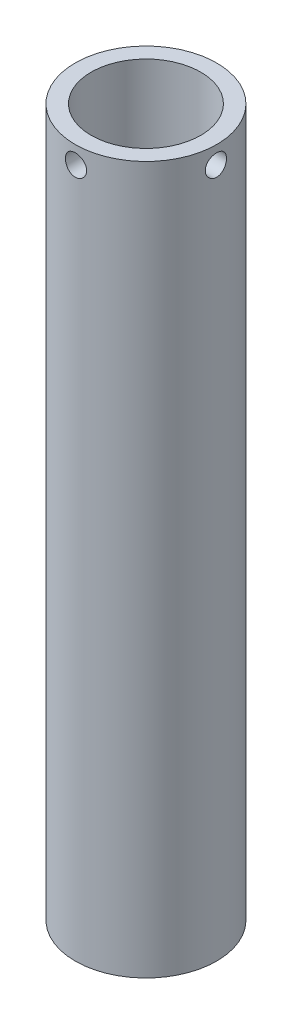
ISO-10303-21;
HEADER;
FILE_DESCRIPTION(('STEP AP214'),'2;1');
FILE_NAME('part.step','',(''),(''),'','','');
FILE_SCHEMA(('AUTOMOTIVE_DESIGN { 1 0 10303 214 1 1 1 1 }'));
ENDSEC;
DATA;
#1=APPLICATION_CONTEXT('core data for automotive mechanical design processes');
#2=APPLICATION_PROTOCOL_DEFINITION('international standard','automotive_design',2000,#1);
#3=PRODUCT_CONTEXT('',#1,'mechanical');
#4=PRODUCT('Part','Part','',(#3));
#5=PRODUCT_RELATED_PRODUCT_CATEGORY('part','',(#4));
#6=PRODUCT_DEFINITION_FORMATION('','',#4);
#7=PRODUCT_DEFINITION_CONTEXT('part definition',#1,'design');
#8=PRODUCT_DEFINITION('design','',#6,#7);
#9=PRODUCT_DEFINITION_SHAPE('','',#8);
#10=(LENGTH_UNIT() NAMED_UNIT(*) SI_UNIT(.MILLI.,.METRE.));
#11=(NAMED_UNIT(*) PLANE_ANGLE_UNIT() SI_UNIT($,.RADIAN.));
#12=(NAMED_UNIT(*) SI_UNIT($,.STERADIAN.) SOLID_ANGLE_UNIT());
#13=UNCERTAINTY_MEASURE_WITH_UNIT(LENGTH_MEASURE(1.E-05),#10,'distance_accuracy_value','');
#14=(GEOMETRIC_REPRESENTATION_CONTEXT(3) GLOBAL_UNCERTAINTY_ASSIGNED_CONTEXT((#13)) GLOBAL_UNIT_ASSIGNED_CONTEXT((#10,
#11,#12)) REPRESENTATION_CONTEXT('',''));
#15=CARTESIAN_POINT('',(0.,0.,0.));
#16=DIRECTION('',(0.,0.,1.));
#17=DIRECTION('',(1.,0.,0.));
#18=AXIS2_PLACEMENT_3D('',#15,#16,#17);
#19=CARTESIAN_POINT('',(0.,20.,0.));
#20=DIRECTION('',(0.,1.,0.));
#21=DIRECTION('',(0.,0.,1.));
#22=AXIS2_PLACEMENT_3D('',#19,#20,#21);
#23=PLANE('',#22);
#24=CARTESIAN_POINT('',(0.,20.,0.));
#25=DIRECTION('',(0.,1.,0.));
#26=DIRECTION('',(0.,0.,1.));
#27=AXIS2_PLACEMENT_3D('',#24,#25,#26);
#28=CIRCLE('',#27,2.);
#29=CARTESIAN_POINT('',(0.,20.,2.));
#30=VERTEX_POINT('',#29);
#31=EDGE_CURVE('E10',#30,#30,#28,.T.);
#32=ORIENTED_EDGE('',*,*,#31,.T.);
#33=EDGE_LOOP('',(#32));
#34=FACE_BOUND('',#33,.T.);
#35=CARTESIAN_POINT('',(0.,20.,0.));
#36=DIRECTION('',(0.,1.,0.));
#37=DIRECTION('',(0.,0.,1.));
#38=AXIS2_PLACEMENT_3D('',#35,#36,#37);
#39=CIRCLE('',#38,1.55);
#40=CARTESIAN_POINT('',(0.,20.,1.55));
#41=VERTEX_POINT('',#40);
#42=EDGE_CURVE('E43',#41,#41,#39,.T.);
#43=ORIENTED_EDGE('',*,*,#42,.F.);
#44=EDGE_LOOP('',(#43));
#45=FACE_BOUND('',#44,.T.);
#46=ADVANCED_FACE('F31',(#34,#45),#23,.T.);
#47=CARTESIAN_POINT('',(0.,0.,0.));
#48=DIRECTION('',(0.,1.,0.));
#49=DIRECTION('',(0.,0.,1.));
#50=AXIS2_PLACEMENT_3D('',#47,#48,#49);
#51=PLANE('',#50);
#52=CARTESIAN_POINT('',(0.,0.,0.));
#53=DIRECTION('',(0.,1.,0.));
#54=DIRECTION('',(0.,0.,1.));
#55=AXIS2_PLACEMENT_3D('',#52,#53,#54);
#56=CIRCLE('',#55,2.);
#57=CARTESIAN_POINT('',(0.,0.,2.));
#58=VERTEX_POINT('',#57);
#59=EDGE_CURVE('E36',#58,#58,#56,.T.);
#60=ORIENTED_EDGE('',*,*,#59,.F.);
#61=EDGE_LOOP('',(#60));
#62=FACE_BOUND('',#61,.T.);
#63=CARTESIAN_POINT('',(0.,0.,0.));
#64=DIRECTION('',(0.,1.,0.));
#65=DIRECTION('',(0.,0.,1.));
#66=AXIS2_PLACEMENT_3D('',#63,#64,#65);
#67=CIRCLE('',#66,1.55);
#68=CARTESIAN_POINT('',(0.,0.,1.55));
#69=VERTEX_POINT('',#68);
#70=EDGE_CURVE('E45',#69,#69,#67,.T.);
#71=ORIENTED_EDGE('',*,*,#70,.T.);
#72=EDGE_LOOP('',(#71));
#73=FACE_BOUND('',#72,.T.);
#74=ADVANCED_FACE('F77',(#62,#73),#51,.F.);
#75=CARTESIAN_POINT('',(0.,20.,0.));
#76=DIRECTION('',(0.,-1.,0.));
#77=DIRECTION('',(0.,0.,-1.));
#78=AXIS2_PLACEMENT_3D('',#75,#76,#77);
#79=CYLINDRICAL_SURFACE('',#78,2.);
#80=CARTESIAN_POINT('',(1.97737199332852,19.5,-0.299999999999993));
#81=CARTESIAN_POINT('',(1.97737227333718,19.483250886142,-0.299999308214561));
#82=CARTESIAN_POINT('',(1.9775871034782,19.4664920498499,-0.298592592776975));
#83=CARTESIAN_POINT('',(1.97842262960648,19.4334429370234,-0.293004393313995));
#84=CARTESIAN_POINT('',(1.97904372146286,19.417153133704,-0.288820202805249));
#85=CARTESIAN_POINT('',(1.98061987797246,19.3855252489106,-0.277805052196162));
#86=CARTESIAN_POINT('',(1.98157468626307,19.3701864474916,-0.270976123362789));
#87=CARTESIAN_POINT('',(1.98371038822629,19.3408745938456,-0.254870126175578));
#88=CARTESIAN_POINT('',(1.98489125076734,19.3269013539571,-0.245593394859738));
#89=CARTESIAN_POINT('',(1.98735657849608,19.3006032366491,-0.224775804837112));
#90=CARTESIAN_POINT('',(1.98864172491611,19.2882908773187,-0.213219211169637));
#91=CARTESIAN_POINT('',(1.99116473633809,19.2657725028689,-0.188203921088872));
#92=CARTESIAN_POINT('',(1.99240259873723,19.2555666035666,-0.174745120157303));
#93=CARTESIAN_POINT('',(1.99469869485637,19.2375046736617,-0.146227271610546));
#94=CARTESIAN_POINT('',(1.99575603687114,19.2296601699355,-0.131160845473151));
#95=CARTESIAN_POINT('',(1.99756441349281,19.2166176802384,-0.0999057700213938));
#96=CARTESIAN_POINT('',(1.99831546428389,19.2114195544314,-0.083717180054135));
#97=CARTESIAN_POINT('',(1.99942182959556,19.2038553222938,-0.0508062246181146));
#98=CARTESIAN_POINT('',(1.99978007177469,19.2014682547226,-0.0340887768779745));
#99=CARTESIAN_POINT('',(2.00007048953917,19.199528813035,-0.000487040803897838));
#100=CARTESIAN_POINT('',(2.00000268880988,19.1999762813361,0.0163972382031469));
#101=CARTESIAN_POINT('',(1.99945099932159,19.2036766675525,0.0497103436401012));
#102=CARTESIAN_POINT('',(1.99897045530496,19.2069070343583,0.0661417382799988));
#103=CARTESIAN_POINT('',(1.9976510004557,19.2160461212645,0.0982265658286242));
#104=CARTESIAN_POINT('',(1.99681208039948,19.2219549103003,0.113879978702692));
#105=CARTESIAN_POINT('',(1.99486438774641,19.2363061993834,0.144032756154059));
#106=CARTESIAN_POINT('',(1.99375460703127,19.2447581930218,0.158527534464714));
#107=CARTESIAN_POINT('',(1.99138887649084,19.263949038734,0.18590158143003));
#108=CARTESIAN_POINT('',(1.99013291704637,19.2746880413414,0.198780743654341));
#109=CARTESIAN_POINT('',(1.98760031638525,19.2982736897653,0.222690896544523));
#110=CARTESIAN_POINT('',(1.98632359324651,19.311140024394,0.233702465901887));
#111=CARTESIAN_POINT('',(1.98390540890704,19.3385482154247,0.253413198677619));
#112=CARTESIAN_POINT('',(1.9827639485393,19.353090082144,0.262112347855991));
#113=CARTESIAN_POINT('',(1.98074555057371,19.3834567925881,0.276953929069202));
#114=CARTESIAN_POINT('',(1.97986881969058,19.3992826267325,0.283094364540156));
#115=CARTESIAN_POINT('',(1.97848280579812,19.4317570510295,0.292624672417751));
#116=CARTESIAN_POINT('',(1.9779734968926,19.4484055831094,0.296014738674645));
#117=CARTESIAN_POINT('',(1.97738490279005,19.4818800179155,0.299921440173304));
#118=CARTESIAN_POINT('',(1.97730149760515,19.4987026376403,0.300465606530098));
#119=CARTESIAN_POINT('',(1.9775632158743,19.5321988389635,0.298738114039631));
#120=CARTESIAN_POINT('',(1.97790832603156,19.5488724251702,0.296466542564597));
#121=CARTESIAN_POINT('',(1.9789844049229,19.5815119635931,0.289195405905525));
#122=CARTESIAN_POINT('',(1.97971343296572,19.5974810409883,0.284209557055635));
#123=CARTESIAN_POINT('',(1.98147360365153,19.6283568184097,0.271665663894167));
#124=CARTESIAN_POINT('',(1.98250476121435,19.6432634659256,0.264107492552772));
#125=CARTESIAN_POINT('',(1.98476271137412,19.671714652067,0.246567355990641));
#126=CARTESIAN_POINT('',(1.98599091855998,19.685248089456,0.236567569123527));
#127=CARTESIAN_POINT('',(1.98850031886671,19.7104545719748,0.214452833674397));
#128=CARTESIAN_POINT('',(1.98978151498058,19.7221275118362,0.202337765489354));
#129=CARTESIAN_POINT('',(1.99226541043477,19.7433805213267,0.176215123925632));
#130=CARTESIAN_POINT('',(1.99346736692084,19.7529423456485,0.162192625354387));
#131=CARTESIAN_POINT('',(1.99564581006403,19.7695745810525,0.132724416052733));
#132=CARTESIAN_POINT('',(1.99662230288912,19.776645060293,0.117278744272086));
#133=CARTESIAN_POINT('',(1.99823653932159,19.7880647484976,0.0854595991722287));
#134=CARTESIAN_POINT('',(1.9988755234358,19.7924239334157,0.0690897717508606));
#135=CARTESIAN_POINT('',(1.99974795331379,19.7983295759075,0.0358401631002399));
#136=CARTESIAN_POINT('',(1.9999814258616,19.7998762192498,0.0189604156261177));
#137=CARTESIAN_POINT('',(2.00001625811828,19.8001083409099,-0.0146529181721615));
#138=CARTESIAN_POINT('',(1.99982183404759,19.7988217361754,-0.0313863140424078));
#139=CARTESIAN_POINT('',(1.99903122103828,19.7934837223158,-0.0643959590646183));
#140=CARTESIAN_POINT('',(1.99843503338533,19.7894323220383,-0.0806722096792994));
#141=CARTESIAN_POINT('',(1.99690757348492,19.7786896248859,-0.112297874875928));
#142=CARTESIAN_POINT('',(1.99597654663389,19.7720002609722,-0.127647958629752));
#143=CARTESIAN_POINT('',(1.993881668991,19.7561745024034,-0.157012223579316));
#144=CARTESIAN_POINT('',(1.99271781064068,19.7470380283039,-0.171026361384137));
#145=CARTESIAN_POINT('',(1.99027302127235,19.7264764602342,-0.197462517038386));
#146=CARTESIAN_POINT('',(1.98899109685188,19.7150307548367,-0.20986841328927));
#147=CARTESIAN_POINT('',(1.986462003378,19.6902189853839,-0.232593616780528));
#148=CARTESIAN_POINT('',(1.98521484255258,19.6768524712351,-0.24291243359796));
#149=CARTESIAN_POINT('',(1.98288896805823,19.6484902033535,-0.261222621645942));
#150=CARTESIAN_POINT('',(1.98181124031397,19.6334857165956,-0.269200588582411));
#151=CARTESIAN_POINT('',(1.97995781822145,19.6023406446473,-0.282511227744084));
#152=CARTESIAN_POINT('',(1.97918181061586,19.5862012584284,-0.287846645149788));
#153=CARTESIAN_POINT('',(1.97819897104965,19.5583245127487,-0.294509903780045));
#154=CARTESIAN_POINT('',(1.97789049876476,19.5467593206151,-0.296565539560832));
#155=CARTESIAN_POINT('',(1.97747691313402,19.5234643416531,-0.299310821153141));
#156=CARTESIAN_POINT('',(1.97737179715231,19.5117345569601,-0.300000484670145));
#157=CARTESIAN_POINT('',(1.97737199332852,19.5,-0.299999999999993));
#158=B_SPLINE_CURVE_WITH_KNOTS('',3,(#80,#81,#82,#83,#84,#85,#86,#87,#88,#89,#90,#91,#92,#93,
#94,#95,#96,#97,#98,#99,#100,#101,#102,#103,#104,#105,#106,#107,#108,#109,#110,#111,#112,#113,
#114,#115,#116,#117,#118,#119,#120,#121,#122,#123,#124,#125,#126,#127,#128,#129,#130,#131,#132,
#133,#134,#135,#136,#137,#138,#139,#140,#141,#142,#143,#144,#145,#146,#147,#148,#149,#150,#151,
#152,#153,#154,#155,#156,#157),.UNSPECIFIED.,.T.,.F.,(4,2,2,2,2,2,2,2,2,2,2,2,2,2,2,2,2,2,2,2,2,
2,2,2,2,2,2,2,2,2,2,2,2,2,2,2,2,2,4),(0.,0.0502044503609731,0.100457893912357,0.150672817067129,
0.200880829732258,0.251448317298208,0.302018584415625,0.352831844211556,0.403642418728989,
0.454071665068781,0.504498107878734,0.554519725031441,0.604542629678788,0.65475463277289,
0.704969941898526,0.755679089332519,0.806388549028679,0.857137503546254,0.907882880888659,
0.958136429207465,1.00838841819981,1.05838878961473,1.10839163057221,1.15877097200258,
1.20915316292358,1.259955075507,1.31075559814368,1.36136808178215,1.41197722234091,
1.46208992724462,1.51220247178561,1.56227836451563,1.61235588313417,1.6629019000219,
1.71345978047368,1.76430175764982,1.81509080689108,1.85026488378318,1.88543850475234),.UNSPECIFIED.);
#159=CARTESIAN_POINT('',(1.97737199332852,19.5,-0.299999999999993));
#160=VERTEX_POINT('',#159);
#161=EDGE_CURVE('E94',#160,#160,#158,.T.);
#162=ORIENTED_EDGE('',*,*,#161,.T.);
#163=EDGE_LOOP('',(#162));
#164=FACE_BOUND('',#163,.T.);
#165=CARTESIAN_POINT('',(0.299999999999994,19.5,1.97737199332852));
#166=CARTESIAN_POINT('',(0.299999308214562,19.483250886142,1.97737227333718));
#167=CARTESIAN_POINT('',(0.298592592776976,19.4664920498499,1.9775871034782));
#168=CARTESIAN_POINT('',(0.293004393313995,19.4334429370234,1.97842262960648));
#169=CARTESIAN_POINT('',(0.28882020280525,19.417153133704,1.97904372146286));
#170=CARTESIAN_POINT('',(0.277805052196162,19.3855252489106,1.98061987797246));
#171=CARTESIAN_POINT('',(0.270976123362789,19.3701864474916,1.98157468626307));
#172=CARTESIAN_POINT('',(0.254870126175578,19.3408745938456,1.98371038822629));
#173=CARTESIAN_POINT('',(0.245593394859739,19.3269013539571,1.98489125076734));
#174=CARTESIAN_POINT('',(0.224775804837113,19.3006032366491,1.98735657849608));
#175=CARTESIAN_POINT('',(0.213219211169636,19.2882908773187,1.98864172491611));
#176=CARTESIAN_POINT('',(0.188203921088872,19.2657725028689,1.99116473633809));
#177=CARTESIAN_POINT('',(0.174745120157304,19.2555666035666,1.99240259873723));
#178=CARTESIAN_POINT('',(0.146227271610548,19.2375046736617,1.99469869485637));
#179=CARTESIAN_POINT('',(0.131160845473152,19.2296601699355,1.99575603687114));
#180=CARTESIAN_POINT('',(0.099905770021394,19.2166176802384,1.99756441349281));
#181=CARTESIAN_POINT('',(0.0837171800541348,19.2114195544314,1.99831546428389));
#182=CARTESIAN_POINT('',(0.050806224618114,19.2038553222938,1.99942182959556));
#183=CARTESIAN_POINT('',(0.0340887768779739,19.2014682547226,1.99978007177469));
#184=CARTESIAN_POINT('',(0.000487040803897157,19.199528813035,2.00007048953917));
#185=CARTESIAN_POINT('',(-0.0163972382031476,19.1999762813361,2.00000268880988));
#186=CARTESIAN_POINT('',(-0.0497103436401018,19.2036766675525,1.99945099932159));
#187=CARTESIAN_POINT('',(-0.0661417382799992,19.2069070343583,1.99897045530496));
#188=CARTESIAN_POINT('',(-0.0982265658286247,19.2160461212645,1.9976510004557));
#189=CARTESIAN_POINT('',(-0.113879978702693,19.2219549103003,1.99681208039948));
#190=CARTESIAN_POINT('',(-0.144032756154059,19.2363061993834,1.99486438774641));
#191=CARTESIAN_POINT('',(-0.158527534464714,19.2447581930217,1.99375460703127));
#192=CARTESIAN_POINT('',(-0.185901581430029,19.263949038734,1.99138887649084));
#193=CARTESIAN_POINT('',(-0.198780743654341,19.2746880413414,1.99013291704637));
#194=CARTESIAN_POINT('',(-0.222690896544523,19.2982736897653,1.98760031638525));
#195=CARTESIAN_POINT('',(-0.233702465901888,19.311140024394,1.98632359324651));
#196=CARTESIAN_POINT('',(-0.253413198677621,19.3385482154248,1.98390540890704));
#197=CARTESIAN_POINT('',(-0.262112347855993,19.353090082144,1.9827639485393));
#198=CARTESIAN_POINT('',(-0.276953929069203,19.3834567925881,1.98074555057371));
#199=CARTESIAN_POINT('',(-0.283094364540157,19.3992826267325,1.97986881969058));
#200=CARTESIAN_POINT('',(-0.292624672417752,19.4317570510295,1.97848280579812));
#201=CARTESIAN_POINT('',(-0.296014738674645,19.4484055831093,1.9779734968926));
#202=CARTESIAN_POINT('',(-0.299921440173304,19.4818800179155,1.97738490279005));
#203=CARTESIAN_POINT('',(-0.300465606530098,19.4987026376403,1.97730149760515));
#204=CARTESIAN_POINT('',(-0.298738114039632,19.5321988389635,1.9775632158743));
#205=CARTESIAN_POINT('',(-0.296466542564598,19.5488724251702,1.97790832603156));
#206=CARTESIAN_POINT('',(-0.289195405905526,19.5815119635931,1.9789844049229));
#207=CARTESIAN_POINT('',(-0.284209557055636,19.5974810409883,1.97971343296572));
#208=CARTESIAN_POINT('',(-0.271665663894168,19.6283568184097,1.98147360365153));
#209=CARTESIAN_POINT('',(-0.264107492552773,19.6432634659256,1.98250476121435));
#210=CARTESIAN_POINT('',(-0.246567355990642,19.671714652067,1.98476271137412));
#211=CARTESIAN_POINT('',(-0.236567569123528,19.685248089456,1.98599091855998));
#212=CARTESIAN_POINT('',(-0.214452833674398,19.7104545719748,1.98850031886671));
#213=CARTESIAN_POINT('',(-0.202337765489354,19.7221275118362,1.98978151498058));
#214=CARTESIAN_POINT('',(-0.176215123925633,19.7433805213267,1.99226541043477));
#215=CARTESIAN_POINT('',(-0.162192625354388,19.7529423456485,1.99346736692084));
#216=CARTESIAN_POINT('',(-0.132724416052734,19.7695745810525,1.99564581006403));
#217=CARTESIAN_POINT('',(-0.117278744272087,19.776645060293,1.99662230288912));
#218=CARTESIAN_POINT('',(-0.0854595991722296,19.7880647484976,1.99823653932159));
#219=CARTESIAN_POINT('',(-0.0690897717508615,19.7924239334157,1.9988755234358));
#220=CARTESIAN_POINT('',(-0.0358401631002402,19.7983295759075,1.99974795331379));
#221=CARTESIAN_POINT('',(-0.0189604156261177,19.7998762192498,1.9999814258616));
#222=CARTESIAN_POINT('',(0.0146529181721619,19.8001083409099,2.00001625811828));
#223=CARTESIAN_POINT('',(0.0313863140424082,19.7988217361754,1.99982183404759));
#224=CARTESIAN_POINT('',(0.0643959590646186,19.7934837223158,1.99903122103828));
#225=CARTESIAN_POINT('',(0.0806722096792996,19.7894323220383,1.99843503338533));
#226=CARTESIAN_POINT('',(0.112297874875929,19.7786896248859,1.99690757348492));
#227=CARTESIAN_POINT('',(0.127647958629753,19.7720002609722,1.99597654663389));
#228=CARTESIAN_POINT('',(0.157012223579316,19.7561745024034,1.993881668991));
#229=CARTESIAN_POINT('',(0.171026361384138,19.7470380283039,1.99271781064068));
#230=CARTESIAN_POINT('',(0.197462517038386,19.7264764602342,1.99027302127236));
#231=CARTESIAN_POINT('',(0.20986841328927,19.7150307548367,1.98899109685188));
#232=CARTESIAN_POINT('',(0.232593616780529,19.6902189853839,1.986462003378));
#233=CARTESIAN_POINT('',(0.242912433597961,19.6768524712351,1.98521484255258));
#234=CARTESIAN_POINT('',(0.261222621645941,19.6484902033535,1.98288896805823));
#235=CARTESIAN_POINT('',(0.26920058858241,19.6334857165956,1.98181124031397));
#236=CARTESIAN_POINT('',(0.282511227744083,19.6023406446473,1.97995781822145));
#237=CARTESIAN_POINT('',(0.287846645149788,19.5862012584284,1.97918181061586));
#238=CARTESIAN_POINT('',(0.294509903780046,19.5583245127487,1.97819897104965));
#239=CARTESIAN_POINT('',(0.296565539560834,19.5467593206151,1.97789049876476));
#240=CARTESIAN_POINT('',(0.299310821153142,19.5234643416531,1.97747691313402));
#241=CARTESIAN_POINT('',(0.300000484670145,19.5117345569601,1.97737179715231));
#242=CARTESIAN_POINT('',(0.299999999999994,19.5,1.97737199332852));
#243=B_SPLINE_CURVE_WITH_KNOTS('',3,(#165,#166,#167,#168,#169,#170,#171,#172,#173,#174,#175,
#176,#177,#178,#179,#180,#181,#182,#183,#184,#185,#186,#187,#188,#189,#190,#191,#192,#193,#194,
#195,#196,#197,#198,#199,#200,#201,#202,#203,#204,#205,#206,#207,#208,#209,#210,#211,#212,#213,
#214,#215,#216,#217,#218,#219,#220,#221,#222,#223,#224,#225,#226,#227,#228,#229,#230,#231,#232,
#233,#234,#235,#236,#237,#238,#239,#240,#241,#242),.UNSPECIFIED.,.T.,.F.,(4,2,2,2,2,2,2,2,2,2,2,
2,2,2,2,2,2,2,2,2,2,2,2,2,2,2,2,2,2,2,2,2,2,2,2,2,2,2,4),(0.,0.0502044503609731,
0.100457893912357,0.150672817067133,0.200880829732258,0.251448317298209,0.302018584415624,
0.352831844211556,0.40364241872899,0.454071665068782,0.504498107878735,0.554519725031443,
0.604542629678788,0.654754632772889,0.704969941898526,0.755679089332522,0.806388549028686,
0.857137503546256,0.907882880888659,0.958136429207468,1.00838841819982,1.05838878961473,
1.10839163057221,1.15877097200258,1.20915316292358,1.25995507550701,1.31075559814368,
1.36136808178215,1.41197722234091,1.46208992724462,1.51220247178561,1.56227836451563,
1.61235588313418,1.6629019000219,1.71345978047369,1.76430175764982,1.81509080689109,
1.85026488378319,1.88543850475234),.UNSPECIFIED.);
#244=CARTESIAN_POINT('',(0.299999999999994,19.5,1.97737199332852));
#245=VERTEX_POINT('',#244);
#246=EDGE_CURVE('E48',#245,#245,#243,.T.);
#247=ORIENTED_EDGE('',*,*,#246,.T.);
#248=EDGE_LOOP('',(#247));
#249=FACE_BOUND('',#248,.T.);
#250=ORIENTED_EDGE('',*,*,#31,.F.);
#251=EDGE_LOOP('',(#250));
#252=FACE_BOUND('',#251,.T.);
#253=ORIENTED_EDGE('',*,*,#59,.T.);
#254=EDGE_LOOP('',(#253));
#255=FACE_BOUND('',#254,.T.);
#256=ADVANCED_FACE('F33',(#164,#249,#252,#255),#79,.T.);
#257=CARTESIAN_POINT('',(0.,20.,0.));
#258=DIRECTION('',(0.,-1.,0.));
#259=DIRECTION('',(0.,0.,-1.));
#260=AXIS2_PLACEMENT_3D('',#257,#258,#259);
#261=CYLINDRICAL_SURFACE('',#260,1.55);
#262=CARTESIAN_POINT('',(1.52069063257455,19.5,-0.299999999999993));
#263=CARTESIAN_POINT('',(1.52069096017263,19.4833190837013,-0.299999370879014));
#264=CARTESIAN_POINT('',(1.52096808208097,19.4666301199517,-0.298604012515745));
#265=CARTESIAN_POINT('',(1.52204512866618,19.4337235099552,-0.293063631969712));
#266=CARTESIAN_POINT('',(1.5228454848342,19.417506264255,-0.288916340331161));
#267=CARTESIAN_POINT('',(1.5248750362984,19.3860239546562,-0.278004840676799));
#268=CARTESIAN_POINT('',(1.52610381914185,19.3707579915457,-0.271243148903173));
#269=CARTESIAN_POINT('',(1.52885128159031,19.341577851142,-0.255301562007906));
#270=CARTESIAN_POINT('',(1.53036994164956,19.3276635828024,-0.246121829913278));
#271=CARTESIAN_POINT('',(1.53354852563834,19.3013965237541,-0.225475067763353));
#272=CARTESIAN_POINT('',(1.53520991361704,19.289064250232,-0.213982156848258));
#273=CARTESIAN_POINT('',(1.53847384770128,19.2664901799835,-0.189091205583584));
#274=CARTESIAN_POINT('',(1.54007638981471,19.2562485248704,-0.175693036280613));
#275=CARTESIAN_POINT('',(1.54305780403044,19.2380673178183,-0.147236601518789));
#276=CARTESIAN_POINT('',(1.54443474927962,19.2301471835618,-0.132165710660983));
#277=CARTESIAN_POINT('',(1.54679340969203,19.2169590375695,-0.100876065207498));
#278=CARTESIAN_POINT('',(1.54777515948599,19.2116907934401,-0.0846574113360692));
#279=CARTESIAN_POINT('',(1.54922247044053,19.2040196214858,-0.0517453928332725));
#280=CARTESIAN_POINT('',(1.54969426267545,19.2015820778171,-0.035060375060818));
#281=CARTESIAN_POINT('',(1.55008999791955,19.1995335742335,-0.0015119886926008));
#282=CARTESIAN_POINT('',(1.55001399050508,19.1999223585335,0.0153513636258025));
#283=CARTESIAN_POINT('',(1.54932754025886,19.2034890663375,0.0485401137564289));
#284=CARTESIAN_POINT('',(1.54872424090379,19.2066297104997,0.0648696870493232));
#285=CARTESIAN_POINT('',(1.54705902651357,19.2155519454001,0.0967655851656381));
#286=CARTESIAN_POINT('',(1.54599709397037,19.2213336369593,0.112331880826134));
#287=CARTESIAN_POINT('',(1.54352207186923,19.2354088962542,0.142366636612072));
#288=CARTESIAN_POINT('',(1.54210692780135,19.2437172246027,0.15682800321661));
#289=CARTESIAN_POINT('',(1.53908174765478,19.2625990166636,0.184165173219989));
#290=CARTESIAN_POINT('',(1.53747169051945,19.2731727252023,0.197040805006789));
#291=CARTESIAN_POINT('',(1.53420375443927,19.2964901231685,0.221062063231891));
#292=CARTESIAN_POINT('',(1.53254552392746,19.3092664329335,0.232176000168016));
#293=CARTESIAN_POINT('',(1.52939317796205,19.336518076221,0.252108405987197));
#294=CARTESIAN_POINT('',(1.52789906523243,19.3509934379356,0.260926836773424));
#295=CARTESIAN_POINT('',(1.52524352484211,19.3812759607913,0.276027841018334));
#296=CARTESIAN_POINT('',(1.52408273531019,19.3970856024851,0.282305559703899));
#297=CARTESIAN_POINT('',(1.5222348388111,19.4295628419573,0.292106520779501));
#298=CARTESIAN_POINT('',(1.52154767435685,19.4462303353484,0.295630097465381));
#299=CARTESIAN_POINT('',(1.52073627365667,19.4796636968164,0.299775964887199));
#300=CARTESIAN_POINT('',(1.52060318299382,19.4964236965664,0.300443895200153));
#301=CARTESIAN_POINT('',(1.52089126978247,19.5298156899063,0.298982075708949));
#302=CARTESIAN_POINT('',(1.52131241791875,19.5464476902197,0.296852473873967));
#303=CARTESIAN_POINT('',(1.52265326068451,19.5789599210654,0.289895301642144));
#304=CARTESIAN_POINT('',(1.5235684915323,19.5948455189444,0.28509187594595));
#305=CARTESIAN_POINT('',(1.52579049795621,19.6255864353446,0.272949120340998));
#306=CARTESIAN_POINT('',(1.52709730402173,19.6404416735274,0.2656095929558));
#307=CARTESIAN_POINT('',(1.52997525107292,19.6689006026792,0.248498758649855));
#308=CARTESIAN_POINT('',(1.53154943540636,19.682486723609,0.238698750754924));
#309=CARTESIAN_POINT('',(1.53477630827212,19.7078382260111,0.216983631737163));
#310=CARTESIAN_POINT('',(1.53642900433661,19.7196034323277,0.20506831737733));
#311=CARTESIAN_POINT('',(1.5396552721459,19.7411508481694,0.17925647844055));
#312=CARTESIAN_POINT('',(1.54122737389398,19.7509022847126,0.165334051863711));
#313=CARTESIAN_POINT('',(1.54409019551211,19.7679276527258,0.136022043181561));
#314=CARTESIAN_POINT('',(1.54538092669799,19.7752016838357,0.120632520113939));
#315=CARTESIAN_POINT('',(1.54752927635049,19.7870202678971,0.0889062257910782));
#316=CARTESIAN_POINT('',(1.54838924028192,19.7915796280515,0.0725751363032127));
#317=CARTESIAN_POINT('',(1.54958919243375,19.7978865452908,0.0393606957667118));
#318=CARTESIAN_POINT('',(1.54992923912381,19.7996344185553,0.0224774070362904));
#319=CARTESIAN_POINT('',(1.55004977536155,19.8002571480613,-0.0110676297148677));
#320=CARTESIAN_POINT('',(1.54983929733634,19.7991783803189,-0.0277285019331752));
#321=CARTESIAN_POINT('',(1.54890130837132,19.7942804147562,-0.0606267952943628));
#322=CARTESIAN_POINT('',(1.54817380310505,19.7904612470073,-0.0768642210818662));
#323=CARTESIAN_POINT('',(1.54628362222001,19.7802109513674,-0.108428096435284));
#324=CARTESIAN_POINT('',(1.54512182004815,19.7737850638498,-0.123756303382816));
#325=CARTESIAN_POINT('',(1.5424884913371,19.7585094362689,-0.15312375214958));
#326=CARTESIAN_POINT('',(1.54101694225086,19.7496595197419,-0.167162900028914));
#327=CARTESIAN_POINT('',(1.53789803073265,19.7296289376126,-0.19378396261014));
#328=CARTESIAN_POINT('',(1.53624833794605,19.7184149211022,-0.20634051281079));
#329=CARTESIAN_POINT('',(1.5329733592993,19.6940433515533,-0.229409614358471));
#330=CARTESIAN_POINT('',(1.53134807928816,19.680885340688,-0.239921682858518));
#331=CARTESIAN_POINT('',(1.52828817977183,19.6528421714997,-0.25870240053037));
#332=CARTESIAN_POINT('',(1.52685562199507,19.6379411061044,-0.266947645722514));
#333=CARTESIAN_POINT('',(1.52436834574742,19.60694192878,-0.280804396729112));
#334=CARTESIAN_POINT('',(1.52331327743314,19.5908449419862,-0.286418342639356));
#335=CARTESIAN_POINT('',(1.52191597942406,19.5622546868549,-0.293737033615855));
#336=CARTESIAN_POINT('',(1.52145925951475,19.5499267968117,-0.296081537072539));
#337=CARTESIAN_POINT('',(1.52084646758226,19.5250674487023,-0.299213232886367));
#338=CARTESIAN_POINT('',(1.52069038637894,19.5125359968636,-0.30000047279528));
#339=CARTESIAN_POINT('',(1.52069063257455,19.5,-0.299999999999993));
#340=B_SPLINE_CURVE_WITH_KNOTS('',3,(#262,#263,#264,#265,#266,#267,#268,#269,#270,#271,#272,
#273,#274,#275,#276,#277,#278,#279,#280,#281,#282,#283,#284,#285,#286,#287,#288,#289,#290,#291,
#292,#293,#294,#295,#296,#297,#298,#299,#300,#301,#302,#303,#304,#305,#306,#307,#308,#309,#310,
#311,#312,#313,#314,#315,#316,#317,#318,#319,#320,#321,#322,#323,#324,#325,#326,#327,#328,#329,
#330,#331,#332,#333,#334,#335,#336,#337,#338,#339),.UNSPECIFIED.,.T.,.F.,(4,2,2,2,2,2,2,2,2,2,2,
2,2,2,2,2,2,2,2,2,2,2,2,2,2,2,2,2,2,2,2,2,2,2,2,2,2,2,4),(0.,0.0499968617008777,
0.100035005986984,0.150025110217153,0.200011844920263,0.250592502622328,0.301176585400261,
0.352172421685237,0.403163788264409,0.453524801589359,0.503881257254986,0.553565903145443,
0.603252445884851,0.653235022908102,0.703223004421802,0.754027405529191,0.804832649746153,
0.855734519030054,0.906630208920537,0.956709358501567,1.00678585936519,1.05641733657609,
1.10605267926958,1.15629634283075,1.20654483637927,1.25751210566589,1.30847732483467,
1.3591619445895,1.40984086395673,1.45969353281203,1.50954565462214,1.55929804986309,
1.6090540679261,1.65956561023958,1.7100890674595,1.76111608247998,1.81209568428537,
1.84967033723325,1.88724384280386),.UNSPECIFIED.);
#341=CARTESIAN_POINT('',(1.52069063257455,19.5,-0.299999999999993));
#342=VERTEX_POINT('',#341);
#343=EDGE_CURVE('E99',#342,#342,#340,.T.);
#344=ORIENTED_EDGE('',*,*,#343,.F.);
#345=EDGE_LOOP('',(#344));
#346=FACE_BOUND('',#345,.T.);
#347=CARTESIAN_POINT('',(0.299999999999994,19.5,1.52069063257455));
#348=CARTESIAN_POINT('',(0.299999370879015,19.4833190837013,1.52069096017263));
#349=CARTESIAN_POINT('',(0.298604012515745,19.4666301199517,1.52096808208097));
#350=CARTESIAN_POINT('',(0.293063631969713,19.4337235099552,1.52204512866618));
#351=CARTESIAN_POINT('',(0.288916340331162,19.417506264255,1.5228454848342));
#352=CARTESIAN_POINT('',(0.2780048406768,19.3860239546562,1.5248750362984));
#353=CARTESIAN_POINT('',(0.271243148903174,19.3707579915457,1.52610381914185));
#354=CARTESIAN_POINT('',(0.255301562007907,19.341577851142,1.52885128159031));
#355=CARTESIAN_POINT('',(0.246121829913279,19.3276635828024,1.53036994164956));
#356=CARTESIAN_POINT('',(0.225475067763354,19.3013965237541,1.53354852563834));
#357=CARTESIAN_POINT('',(0.213982156848259,19.289064250232,1.53520991361704));
#358=CARTESIAN_POINT('',(0.189091205583585,19.2664901799835,1.53847384770128));
#359=CARTESIAN_POINT('',(0.175693036280615,19.2562485248704,1.54007638981471));
#360=CARTESIAN_POINT('',(0.14723660151879,19.2380673178183,1.54305780403044));
#361=CARTESIAN_POINT('',(0.132165710660984,19.2301471835618,1.54443474927962));
#362=CARTESIAN_POINT('',(0.100876065207498,19.2169590375695,1.54679340969203));
#363=CARTESIAN_POINT('',(0.084657411336069,19.2116907934401,1.54777515948599));
#364=CARTESIAN_POINT('',(0.0517453928332725,19.2040196214858,1.54922247044053));
#365=CARTESIAN_POINT('',(0.035060375060818,19.2015820778171,1.54969426267545));
#366=CARTESIAN_POINT('',(0.00151198869260084,19.1995335742335,1.55008999791955));
#367=CARTESIAN_POINT('',(-0.0153513636258024,19.1999223585335,1.55001399050508));
#368=CARTESIAN_POINT('',(-0.0485401137564286,19.2034890663375,1.54932754025886));
#369=CARTESIAN_POINT('',(-0.0648696870493225,19.2066297104997,1.54872424090379));
#370=CARTESIAN_POINT('',(-0.0967655851656375,19.2155519454001,1.54705902651357));
#371=CARTESIAN_POINT('',(-0.112331880826133,19.2213336369593,1.54599709397037));
#372=CARTESIAN_POINT('',(-0.142366636612073,19.2354088962542,1.54352207186923));
#373=CARTESIAN_POINT('',(-0.156828003216611,19.2437172246027,1.54210692780135));
#374=CARTESIAN_POINT('',(-0.18416517321999,19.2625990166636,1.53908174765478));
#375=CARTESIAN_POINT('',(-0.19704080500679,19.2731727252023,1.53747169051945));
#376=CARTESIAN_POINT('',(-0.221062063231891,19.2964901231685,1.53420375443927));
#377=CARTESIAN_POINT('',(-0.232176000168016,19.3092664329335,1.53254552392746));
#378=CARTESIAN_POINT('',(-0.252108405987198,19.336518076221,1.52939317796205));
#379=CARTESIAN_POINT('',(-0.260926836773425,19.3509934379356,1.52789906523243));
#380=CARTESIAN_POINT('',(-0.276027841018335,19.3812759607913,1.52524352484211));
#381=CARTESIAN_POINT('',(-0.2823055597039,19.3970856024851,1.52408273531019));
#382=CARTESIAN_POINT('',(-0.292106520779502,19.4295628419573,1.5222348388111));
#383=CARTESIAN_POINT('',(-0.295630097465382,19.4462303353484,1.52154767435685));
#384=CARTESIAN_POINT('',(-0.2997759648872,19.4796636968164,1.52073627365667));
#385=CARTESIAN_POINT('',(-0.300443895200153,19.4964236965664,1.52060318299382));
#386=CARTESIAN_POINT('',(-0.29898207570895,19.5298156899063,1.52089126978247));
#387=CARTESIAN_POINT('',(-0.296852473873968,19.5464476902197,1.52131241791875));
#388=CARTESIAN_POINT('',(-0.289895301642145,19.5789599210654,1.52265326068451));
#389=CARTESIAN_POINT('',(-0.28509187594595,19.5948455189444,1.5235684915323));
#390=CARTESIAN_POINT('',(-0.272949120340999,19.6255864353446,1.52579049795621));
#391=CARTESIAN_POINT('',(-0.265609592955801,19.6404416735274,1.52709730402173));
#392=CARTESIAN_POINT('',(-0.248498758649856,19.6689006026792,1.52997525107292));
#393=CARTESIAN_POINT('',(-0.238698750754925,19.682486723609,1.53154943540636));
#394=CARTESIAN_POINT('',(-0.216983631737164,19.7078382260111,1.53477630827212));
#395=CARTESIAN_POINT('',(-0.205068317377331,19.7196034323277,1.53642900433661));
#396=CARTESIAN_POINT('',(-0.179256478440551,19.7411508481694,1.5396552721459));
#397=CARTESIAN_POINT('',(-0.165334051863713,19.7509022847126,1.54122737389398));
#398=CARTESIAN_POINT('',(-0.136022043181562,19.7679276527258,1.54409019551211));
#399=CARTESIAN_POINT('',(-0.12063252011394,19.7752016838357,1.54538092669799));
#400=CARTESIAN_POINT('',(-0.0889062257910791,19.7870202678971,1.54752927635049));
#401=CARTESIAN_POINT('',(-0.0725751363032133,19.7915796280515,1.54838924028192));
#402=CARTESIAN_POINT('',(-0.0393606957667115,19.7978865452908,1.54958919243375));
#403=CARTESIAN_POINT('',(-0.0224774070362894,19.7996344185553,1.54992923912381));
#404=CARTESIAN_POINT('',(0.0110676297148693,19.8002571480613,1.55004977536155));
#405=CARTESIAN_POINT('',(0.0277285019331765,19.7991783803189,1.54983929733634));
#406=CARTESIAN_POINT('',(0.0606267952943636,19.7942804147562,1.54890130837132));
#407=CARTESIAN_POINT('',(0.0768642210818667,19.7904612470073,1.54817380310505));
#408=CARTESIAN_POINT('',(0.108428096435285,19.7802109513674,1.54628362222001));
#409=CARTESIAN_POINT('',(0.123756303382817,19.7737850638498,1.54512182004815));
#410=CARTESIAN_POINT('',(0.153123752149581,19.7585094362689,1.5424884913371));
#411=CARTESIAN_POINT('',(0.167162900028915,19.7496595197419,1.54101694225086));
#412=CARTESIAN_POINT('',(0.193783962610141,19.7296289376126,1.53789803073265));
#413=CARTESIAN_POINT('',(0.206340512810791,19.7184149211022,1.53624833794605));
#414=CARTESIAN_POINT('',(0.229409614358472,19.6940433515533,1.5329733592993));
#415=CARTESIAN_POINT('',(0.239921682858519,19.680885340688,1.53134807928816));
#416=CARTESIAN_POINT('',(0.258702400530371,19.6528421714997,1.52828817977183));
#417=CARTESIAN_POINT('',(0.266947645722514,19.6379411061044,1.52685562199507));
#418=CARTESIAN_POINT('',(0.280804396729112,19.60694192878,1.52436834574742));
#419=CARTESIAN_POINT('',(0.286418342639356,19.5908449419862,1.52331327743314));
#420=CARTESIAN_POINT('',(0.293737033615855,19.5622546868549,1.52191597942406));
#421=CARTESIAN_POINT('',(0.296081537072539,19.5499267968117,1.52145925951475));
#422=CARTESIAN_POINT('',(0.299213232886368,19.5250674487023,1.52084646758226));
#423=CARTESIAN_POINT('',(0.300000472795281,19.5125359968636,1.52069038637894));
#424=CARTESIAN_POINT('',(0.299999999999994,19.5,1.52069063257455));
#425=B_SPLINE_CURVE_WITH_KNOTS('',3,(#347,#348,#349,#350,#351,#352,#353,#354,#355,#356,#357,
#358,#359,#360,#361,#362,#363,#364,#365,#366,#367,#368,#369,#370,#371,#372,#373,#374,#375,#376,
#377,#378,#379,#380,#381,#382,#383,#384,#385,#386,#387,#388,#389,#390,#391,#392,#393,#394,#395,
#396,#397,#398,#399,#400,#401,#402,#403,#404,#405,#406,#407,#408,#409,#410,#411,#412,#413,#414,
#415,#416,#417,#418,#419,#420,#421,#422,#423,#424),.UNSPECIFIED.,.T.,.F.,(4,2,2,2,2,2,2,2,2,2,2,
2,2,2,2,2,2,2,2,2,2,2,2,2,2,2,2,2,2,2,2,2,2,2,2,2,2,2,4),(0.,0.0499968617008777,
0.100035005986984,0.150025110217153,0.200011844920263,0.250592502622327,0.301176585400261,
0.352172421685239,0.40316378826441,0.45352480158936,0.503881257254986,0.553565903145443,
0.603252445884853,0.653235022908105,0.703223004421805,0.754027405529194,0.804832649746155,
0.855734519030056,0.90663020892054,0.956709358501569,1.0067858593652,1.0564173365761,
1.10605267926958,1.15629634283075,1.20654483637927,1.25751210566589,1.30847732483467,
1.3591619445895,1.40984086395673,1.45969353281204,1.50954565462214,1.5592980498631,
1.60905406792611,1.65956561023959,1.71008906745951,1.76111608247999,1.81209568428537,
1.84967033723325,1.88724384280387),.UNSPECIFIED.);
#426=CARTESIAN_POINT('',(0.299999999999994,19.5,1.52069063257455));
#427=VERTEX_POINT('',#426);
#428=EDGE_CURVE('E56',#427,#427,#425,.T.);
#429=ORIENTED_EDGE('',*,*,#428,.F.);
#430=EDGE_LOOP('',(#429));
#431=FACE_BOUND('',#430,.T.);
#432=ORIENTED_EDGE('',*,*,#42,.T.);
#433=EDGE_LOOP('',(#432));
#434=FACE_BOUND('',#433,.T.);
#435=ORIENTED_EDGE('',*,*,#70,.F.);
#436=EDGE_LOOP('',(#435));
#437=FACE_BOUND('',#436,.T.);
#438=ADVANCED_FACE('F66',(#346,#431,#434,#437),#261,.F.);
#439=CARTESIAN_POINT('',(0.,19.5,2.));
#440=DIRECTION('',(0.,0.,1.));
#441=DIRECTION('',(1.,0.,0.));
#442=AXIS2_PLACEMENT_3D('',#439,#440,#441);
#443=CYLINDRICAL_SURFACE('',#442,0.299999999999994);
#444=ORIENTED_EDGE('',*,*,#428,.T.);
#445=EDGE_LOOP('',(#444));
#446=FACE_BOUND('',#445,.T.);
#447=ORIENTED_EDGE('',*,*,#246,.F.);
#448=EDGE_LOOP('',(#447));
#449=FACE_BOUND('',#448,.T.);
#450=ADVANCED_FACE('F61',(#446,#449),#443,.F.);
#451=CARTESIAN_POINT('',(2.,19.5,0.));
#452=DIRECTION('',(1.,0.,0.));
#453=DIRECTION('',(0.,0.,-1.));
#454=AXIS2_PLACEMENT_3D('',#451,#452,#453);
#455=CYLINDRICAL_SURFACE('',#454,0.299999999999993);
#456=ORIENTED_EDGE('',*,*,#343,.T.);
#457=EDGE_LOOP('',(#456));
#458=FACE_BOUND('',#457,.T.);
#459=ORIENTED_EDGE('',*,*,#161,.F.);
#460=EDGE_LOOP('',(#459));
#461=FACE_BOUND('',#460,.T.);
#462=ADVANCED_FACE('F65',(#458,#461),#455,.F.);
#463=CLOSED_SHELL('',(#46,#74,#256,#438,#450,#462));
#464=MANIFOLD_SOLID_BREP('B2',#463);
#465=ADVANCED_BREP_SHAPE_REPRESENTATION('',(#18,#464),#14);
#466=SHAPE_DEFINITION_REPRESENTATION(#9,#465);
ENDSEC;
END-ISO-10303-21;
